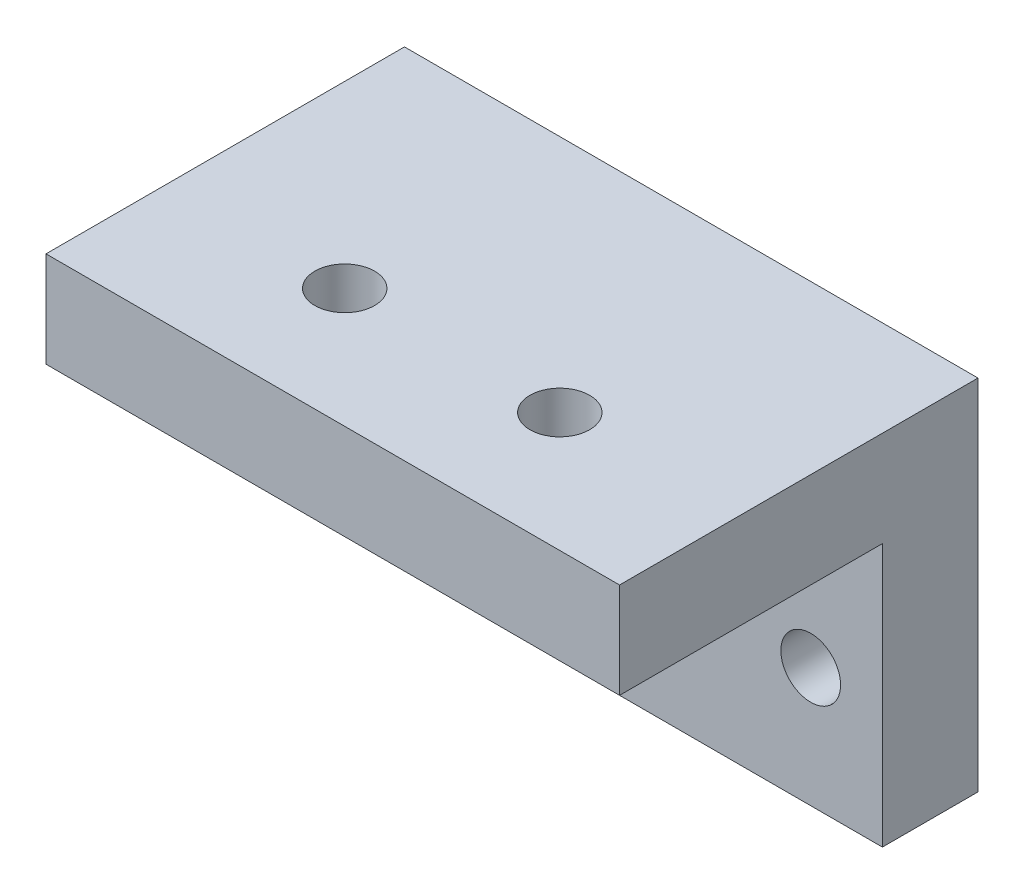
ISO-10303-21;
HEADER;
FILE_DESCRIPTION(('STEP AP214'),'2;1');
FILE_NAME('part.step','',(''),(''),'','','');
FILE_SCHEMA(('AUTOMOTIVE_DESIGN { 1 0 10303 214 1 1 1 1 }'));
ENDSEC;
DATA;
#1=APPLICATION_CONTEXT('core data for automotive mechanical design processes');
#2=APPLICATION_PROTOCOL_DEFINITION('international standard','automotive_design',2000,#1);
#3=PRODUCT_CONTEXT('',#1,'mechanical');
#4=PRODUCT('Part','Part','',(#3));
#5=PRODUCT_RELATED_PRODUCT_CATEGORY('part','',(#4));
#6=PRODUCT_DEFINITION_FORMATION('','',#4);
#7=PRODUCT_DEFINITION_CONTEXT('part definition',#1,'design');
#8=PRODUCT_DEFINITION('design','',#6,#7);
#9=PRODUCT_DEFINITION_SHAPE('','',#8);
#10=(LENGTH_UNIT() NAMED_UNIT(*) SI_UNIT(.MILLI.,.METRE.));
#11=(NAMED_UNIT(*) PLANE_ANGLE_UNIT() SI_UNIT($,.RADIAN.));
#12=(NAMED_UNIT(*) SI_UNIT($,.STERADIAN.) SOLID_ANGLE_UNIT());
#13=UNCERTAINTY_MEASURE_WITH_UNIT(LENGTH_MEASURE(1.E-05),#10,'distance_accuracy_value','');
#14=(GEOMETRIC_REPRESENTATION_CONTEXT(3) GLOBAL_UNCERTAINTY_ASSIGNED_CONTEXT((#13)) GLOBAL_UNIT_ASSIGNED_CONTEXT((#10,
#11,#12)) REPRESENTATION_CONTEXT('',''));
#15=CARTESIAN_POINT('',(0.,0.,0.));
#16=DIRECTION('',(0.,0.,1.));
#17=DIRECTION('',(1.,0.,0.));
#18=AXIS2_PLACEMENT_3D('',#15,#16,#17);
#19=CARTESIAN_POINT('',(12.,7.5,4.));
#20=DIRECTION('',(-1.,0.,0.));
#21=DIRECTION('',(0.,-1.,0.));
#22=AXIS2_PLACEMENT_3D('',#19,#20,#21);
#23=PLANE('',#22);
#24=DIRECTION('',(0.,1.,0.));
#25=VECTOR('',#24,1.);
#26=CARTESIAN_POINT('',(12.,7.5,0.));
#27=LINE('',#26,#25);
#28=CARTESIAN_POINT('',(12.,-7.5,0.));
#29=VERTEX_POINT('',#28);
#30=CARTESIAN_POINT('',(12.,7.5,0.));
#31=VERTEX_POINT('',#30);
#32=EDGE_CURVE('E105',#29,#31,#27,.T.);
#33=ORIENTED_EDGE('',*,*,#32,.T.);
#34=DIRECTION('',(0.,0.,-1.));
#35=VECTOR('',#34,1.);
#36=CARTESIAN_POINT('',(12.,7.5,4.));
#37=LINE('',#36,#35);
#38=CARTESIAN_POINT('',(12.,7.5,15.));
#39=VERTEX_POINT('',#38);
#40=EDGE_CURVE('E11',#39,#31,#37,.T.);
#41=ORIENTED_EDGE('',*,*,#40,.F.);
#42=DIRECTION('',(0.,1.,0.));
#43=VECTOR('',#42,1.);
#44=CARTESIAN_POINT('',(12.,7.5,15.));
#45=LINE('',#44,#43);
#46=CARTESIAN_POINT('',(12.,3.5,15.));
#47=VERTEX_POINT('',#46);
#48=EDGE_CURVE('E143',#47,#39,#45,.T.);
#49=ORIENTED_EDGE('',*,*,#48,.F.);
#50=DIRECTION('',(0.,0.,-1.));
#51=VECTOR('',#50,1.);
#52=CARTESIAN_POINT('',(12.,3.5,15.));
#53=LINE('',#52,#51);
#54=CARTESIAN_POINT('',(12.,3.5,4.));
#55=VERTEX_POINT('',#54);
#56=EDGE_CURVE('E114',#47,#55,#53,.T.);
#57=ORIENTED_EDGE('',*,*,#56,.T.);
#58=DIRECTION('',(0.,1.,0.));
#59=VECTOR('',#58,1.);
#60=CARTESIAN_POINT('',(12.,7.5,4.));
#61=LINE('',#60,#59);
#62=CARTESIAN_POINT('',(12.,-7.5,4.));
#63=VERTEX_POINT('',#62);
#64=EDGE_CURVE('E98',#63,#55,#61,.T.);
#65=ORIENTED_EDGE('',*,*,#64,.F.);
#66=DIRECTION('',(0.,0.,-1.));
#67=VECTOR('',#66,1.);
#68=CARTESIAN_POINT('',(12.,-7.5,4.));
#69=LINE('',#68,#67);
#70=EDGE_CURVE('E88',#63,#29,#69,.T.);
#71=ORIENTED_EDGE('',*,*,#70,.T.);
#72=EDGE_LOOP('',(#33,#41,#49,#57,#65,#71));
#73=FACE_BOUND('',#72,.T.);
#74=ADVANCED_FACE('F44',(#73),#23,.F.);
#75=CARTESIAN_POINT('',(-12.,7.5,4.));
#76=DIRECTION('',(0.,-1.,0.));
#77=DIRECTION('',(0.,0.,-1.));
#78=AXIS2_PLACEMENT_3D('',#75,#76,#77);
#79=PLANE('',#78);
#80=CARTESIAN_POINT('',(-4.5,7.5,10.));
#81=DIRECTION('',(0.,-1.,0.));
#82=DIRECTION('',(0.,0.,-1.));
#83=AXIS2_PLACEMENT_3D('',#80,#81,#82);
#84=CIRCLE('',#83,1.25);
#85=CARTESIAN_POINT('',(-4.5,7.5,8.75));
#86=VERTEX_POINT('',#85);
#87=EDGE_CURVE('E177',#86,#86,#84,.T.);
#88=ORIENTED_EDGE('',*,*,#87,.T.);
#89=EDGE_LOOP('',(#88));
#90=FACE_BOUND('',#89,.T.);
#91=CARTESIAN_POINT('',(4.50000000000001,7.5,10.));
#92=DIRECTION('',(0.,-1.,0.));
#93=DIRECTION('',(0.,0.,-1.));
#94=AXIS2_PLACEMENT_3D('',#91,#92,#93);
#95=CIRCLE('',#94,1.25);
#96=CARTESIAN_POINT('',(4.50000000000001,7.5,8.75));
#97=VERTEX_POINT('',#96);
#98=EDGE_CURVE('E191',#97,#97,#95,.T.);
#99=ORIENTED_EDGE('',*,*,#98,.T.);
#100=EDGE_LOOP('',(#99));
#101=FACE_BOUND('',#100,.T.);
#102=DIRECTION('',(-1.,0.,0.));
#103=VECTOR('',#102,1.);
#104=CARTESIAN_POINT('',(-12.,7.5,0.));
#105=LINE('',#104,#103);
#106=CARTESIAN_POINT('',(-12.,7.5,0.));
#107=VERTEX_POINT('',#106);
#108=EDGE_CURVE('E110',#31,#107,#105,.T.);
#109=ORIENTED_EDGE('',*,*,#108,.T.);
#110=DIRECTION('',(0.,0.,-1.));
#111=VECTOR('',#110,1.);
#112=CARTESIAN_POINT('',(-12.,7.5,4.));
#113=LINE('',#112,#111);
#114=CARTESIAN_POINT('',(-12.,7.5,15.));
#115=VERTEX_POINT('',#114);
#116=EDGE_CURVE('E52',#115,#107,#113,.T.);
#117=ORIENTED_EDGE('',*,*,#116,.F.);
#118=DIRECTION('',(-1.,0.,0.));
#119=VECTOR('',#118,1.);
#120=CARTESIAN_POINT('',(-12.,7.5,15.));
#121=LINE('',#120,#119);
#122=EDGE_CURVE('E139',#39,#115,#121,.T.);
#123=ORIENTED_EDGE('',*,*,#122,.F.);
#124=ORIENTED_EDGE('',*,*,#40,.T.);
#125=EDGE_LOOP('',(#109,#117,#123,#124));
#126=FACE_BOUND('',#125,.T.);
#127=ADVANCED_FACE('F134',(#90,#101,#126),#79,.F.);
#128=CARTESIAN_POINT('',(-12.,7.5,4.));
#129=DIRECTION('',(1.,0.,0.));
#130=DIRECTION('',(0.,1.,0.));
#131=AXIS2_PLACEMENT_3D('',#128,#129,#130);
#132=PLANE('',#131);
#133=DIRECTION('',(0.,-1.,0.));
#134=VECTOR('',#133,1.);
#135=CARTESIAN_POINT('',(-12.,7.5,0.));
#136=LINE('',#135,#134);
#137=CARTESIAN_POINT('',(-12.,-7.5,0.));
#138=VERTEX_POINT('',#137);
#139=EDGE_CURVE('E97',#107,#138,#136,.T.);
#140=ORIENTED_EDGE('',*,*,#139,.T.);
#141=DIRECTION('',(0.,0.,-1.));
#142=VECTOR('',#141,1.);
#143=CARTESIAN_POINT('',(-12.,-7.5,4.));
#144=LINE('',#143,#142);
#145=CARTESIAN_POINT('',(-12.,-7.5,4.));
#146=VERTEX_POINT('',#145);
#147=EDGE_CURVE('E93',#146,#138,#144,.T.);
#148=ORIENTED_EDGE('',*,*,#147,.F.);
#149=DIRECTION('',(0.,-1.,0.));
#150=VECTOR('',#149,1.);
#151=CARTESIAN_POINT('',(-12.,7.5,4.));
#152=LINE('',#151,#150);
#153=CARTESIAN_POINT('',(-12.,3.5,4.));
#154=VERTEX_POINT('',#153);
#155=EDGE_CURVE('E160',#154,#146,#152,.T.);
#156=ORIENTED_EDGE('',*,*,#155,.F.);
#157=DIRECTION('',(0.,0.,-1.));
#158=VECTOR('',#157,1.);
#159=CARTESIAN_POINT('',(-12.,3.5,15.));
#160=LINE('',#159,#158);
#161=CARTESIAN_POINT('',(-12.,3.5,15.));
#162=VERTEX_POINT('',#161);
#163=EDGE_CURVE('E107',#162,#154,#160,.T.);
#164=ORIENTED_EDGE('',*,*,#163,.F.);
#165=DIRECTION('',(0.,-1.,0.));
#166=VECTOR('',#165,1.);
#167=CARTESIAN_POINT('',(-12.,7.5,15.));
#168=LINE('',#167,#166);
#169=EDGE_CURVE('E131',#115,#162,#168,.T.);
#170=ORIENTED_EDGE('',*,*,#169,.F.);
#171=ORIENTED_EDGE('',*,*,#116,.T.);
#172=EDGE_LOOP('',(#140,#148,#156,#164,#170,#171));
#173=FACE_BOUND('',#172,.T.);
#174=ADVANCED_FACE('F129',(#173),#132,.F.);
#175=CARTESIAN_POINT('',(-12.,-7.5,4.));
#176=DIRECTION('',(0.,1.,0.));
#177=DIRECTION('',(0.,0.,1.));
#178=AXIS2_PLACEMENT_3D('',#175,#176,#177);
#179=PLANE('',#178);
#180=DIRECTION('',(1.,0.,0.));
#181=VECTOR('',#180,1.);
#182=CARTESIAN_POINT('',(-12.,-7.5,0.));
#183=LINE('',#182,#181);
#184=EDGE_CURVE('E83',#138,#29,#183,.T.);
#185=ORIENTED_EDGE('',*,*,#184,.T.);
#186=ORIENTED_EDGE('',*,*,#70,.F.);
#187=DIRECTION('',(1.,0.,0.));
#188=VECTOR('',#187,1.);
#189=CARTESIAN_POINT('',(-12.,-7.5,4.));
#190=LINE('',#189,#188);
#191=EDGE_CURVE('E66',#146,#63,#190,.T.);
#192=ORIENTED_EDGE('',*,*,#191,.F.);
#193=ORIENTED_EDGE('',*,*,#147,.T.);
#194=EDGE_LOOP('',(#185,#186,#192,#193));
#195=FACE_BOUND('',#194,.T.);
#196=ADVANCED_FACE('F90',(#195),#179,.F.);
#197=CARTESIAN_POINT('',(0.,0.,4.));
#198=DIRECTION('',(0.,0.,1.));
#199=DIRECTION('',(1.,0.,0.));
#200=AXIS2_PLACEMENT_3D('',#197,#198,#199);
#201=PLANE('',#200);
#202=CARTESIAN_POINT('',(-9.,-2.5,4.));
#203=DIRECTION('',(0.,0.,1.));
#204=DIRECTION('',(1.,0.,0.));
#205=AXIS2_PLACEMENT_3D('',#202,#203,#204);
#206=CIRCLE('',#205,1.25);
#207=CARTESIAN_POINT('',(-7.75,-2.5,4.));
#208=VERTEX_POINT('',#207);
#209=EDGE_CURVE('E182',#208,#208,#206,.T.);
#210=ORIENTED_EDGE('',*,*,#209,.F.);
#211=EDGE_LOOP('',(#210));
#212=FACE_BOUND('',#211,.T.);
#213=CARTESIAN_POINT('',(9.,-2.5,4.));
#214=DIRECTION('',(0.,0.,1.));
#215=DIRECTION('',(1.,0.,0.));
#216=AXIS2_PLACEMENT_3D('',#213,#214,#215);
#217=CIRCLE('',#216,1.25);
#218=CARTESIAN_POINT('',(10.25,-2.5,4.));
#219=VERTEX_POINT('',#218);
#220=EDGE_CURVE('E172',#219,#219,#217,.T.);
#221=ORIENTED_EDGE('',*,*,#220,.F.);
#222=EDGE_LOOP('',(#221));
#223=FACE_BOUND('',#222,.T.);
#224=DIRECTION('',(1.,0.,0.));
#225=VECTOR('',#224,1.);
#226=CARTESIAN_POINT('',(-12.,3.5,4.));
#227=LINE('',#226,#225);
#228=EDGE_CURVE('E58',#154,#55,#227,.T.);
#229=ORIENTED_EDGE('',*,*,#228,.F.);
#230=ORIENTED_EDGE('',*,*,#155,.T.);
#231=ORIENTED_EDGE('',*,*,#191,.T.);
#232=ORIENTED_EDGE('',*,*,#64,.T.);
#233=EDGE_LOOP('',(#229,#230,#231,#232));
#234=FACE_BOUND('',#233,.T.);
#235=ADVANCED_FACE('F162',(#212,#223,#234),#201,.T.);
#236=CARTESIAN_POINT('',(0.,0.,0.));
#237=DIRECTION('',(0.,0.,1.));
#238=DIRECTION('',(1.,0.,0.));
#239=AXIS2_PLACEMENT_3D('',#236,#237,#238);
#240=PLANE('',#239);
#241=CARTESIAN_POINT('',(-9.,-2.5,0.));
#242=DIRECTION('',(0.,0.,1.));
#243=DIRECTION('',(1.,0.,0.));
#244=AXIS2_PLACEMENT_3D('',#241,#242,#243);
#245=CIRCLE('',#244,1.25);
#246=CARTESIAN_POINT('',(-7.75,-2.5,0.));
#247=VERTEX_POINT('',#246);
#248=EDGE_CURVE('E158',#247,#247,#245,.T.);
#249=ORIENTED_EDGE('',*,*,#248,.T.);
#250=EDGE_LOOP('',(#249));
#251=FACE_BOUND('',#250,.T.);
#252=CARTESIAN_POINT('',(9.,-2.5,0.));
#253=DIRECTION('',(0.,0.,1.));
#254=DIRECTION('',(1.,0.,0.));
#255=AXIS2_PLACEMENT_3D('',#252,#253,#254);
#256=CIRCLE('',#255,1.25);
#257=CARTESIAN_POINT('',(10.25,-2.5,0.));
#258=VERTEX_POINT('',#257);
#259=EDGE_CURVE('E178',#258,#258,#256,.T.);
#260=ORIENTED_EDGE('',*,*,#259,.T.);
#261=EDGE_LOOP('',(#260));
#262=FACE_BOUND('',#261,.T.);
#263=ORIENTED_EDGE('',*,*,#32,.F.);
#264=ORIENTED_EDGE('',*,*,#184,.F.);
#265=ORIENTED_EDGE('',*,*,#139,.F.);
#266=ORIENTED_EDGE('',*,*,#108,.F.);
#267=EDGE_LOOP('',(#263,#264,#265,#266));
#268=FACE_BOUND('',#267,.T.);
#269=ADVANCED_FACE('F106',(#251,#262,#268),#240,.F.);
#270=CARTESIAN_POINT('',(-12.,3.5,15.));
#271=DIRECTION('',(0.,1.,0.));
#272=DIRECTION('',(0.,0.,1.));
#273=AXIS2_PLACEMENT_3D('',#270,#271,#272);
#274=PLANE('',#273);
#275=CARTESIAN_POINT('',(-4.5,3.5,10.));
#276=DIRECTION('',(0.,-1.,0.));
#277=DIRECTION('',(0.,0.,-1.));
#278=AXIS2_PLACEMENT_3D('',#275,#276,#277);
#279=CIRCLE('',#278,1.25);
#280=CARTESIAN_POINT('',(-4.5,3.5,8.75));
#281=VERTEX_POINT('',#280);
#282=EDGE_CURVE('E198',#281,#281,#279,.T.);
#283=ORIENTED_EDGE('',*,*,#282,.F.);
#284=EDGE_LOOP('',(#283));
#285=FACE_BOUND('',#284,.T.);
#286=CARTESIAN_POINT('',(4.50000000000001,3.5,10.));
#287=DIRECTION('',(0.,-1.,0.));
#288=DIRECTION('',(0.,0.,-1.));
#289=AXIS2_PLACEMENT_3D('',#286,#287,#288);
#290=CIRCLE('',#289,1.25);
#291=CARTESIAN_POINT('',(4.50000000000001,3.5,8.75));
#292=VERTEX_POINT('',#291);
#293=EDGE_CURVE('E188',#292,#292,#290,.T.);
#294=ORIENTED_EDGE('',*,*,#293,.F.);
#295=EDGE_LOOP('',(#294));
#296=FACE_BOUND('',#295,.T.);
#297=ORIENTED_EDGE('',*,*,#228,.T.);
#298=ORIENTED_EDGE('',*,*,#56,.F.);
#299=DIRECTION('',(1.,0.,0.));
#300=VECTOR('',#299,1.);
#301=CARTESIAN_POINT('',(-12.,3.5,15.));
#302=LINE('',#301,#300);
#303=EDGE_CURVE('E151',#162,#47,#302,.T.);
#304=ORIENTED_EDGE('',*,*,#303,.F.);
#305=ORIENTED_EDGE('',*,*,#163,.T.);
#306=EDGE_LOOP('',(#297,#298,#304,#305));
#307=FACE_BOUND('',#306,.T.);
#308=ADVANCED_FACE('F164',(#285,#296,#307),#274,.F.);
#309=CARTESIAN_POINT('',(0.,0.,15.));
#310=DIRECTION('',(0.,0.,1.));
#311=DIRECTION('',(1.,0.,0.));
#312=AXIS2_PLACEMENT_3D('',#309,#310,#311);
#313=PLANE('',#312);
#314=ORIENTED_EDGE('',*,*,#169,.T.);
#315=ORIENTED_EDGE('',*,*,#303,.T.);
#316=ORIENTED_EDGE('',*,*,#48,.T.);
#317=ORIENTED_EDGE('',*,*,#122,.T.);
#318=EDGE_LOOP('',(#314,#315,#316,#317));
#319=FACE_BOUND('',#318,.T.);
#320=ADVANCED_FACE('F142',(#319),#313,.T.);
#321=CARTESIAN_POINT('',(9.,-2.5,0.));
#322=DIRECTION('',(0.,0.,1.));
#323=DIRECTION('',(1.,0.,0.));
#324=AXIS2_PLACEMENT_3D('',#321,#322,#323);
#325=CYLINDRICAL_SURFACE('',#324,1.25);
#326=ORIENTED_EDGE('',*,*,#259,.F.);
#327=EDGE_LOOP('',(#326));
#328=FACE_BOUND('',#327,.T.);
#329=ORIENTED_EDGE('',*,*,#220,.T.);
#330=EDGE_LOOP('',(#329));
#331=FACE_BOUND('',#330,.T.);
#332=ADVANCED_FACE('F227',(#328,#331),#325,.F.);
#333=CARTESIAN_POINT('',(-9.,-2.5,0.));
#334=DIRECTION('',(0.,0.,1.));
#335=DIRECTION('',(1.,0.,0.));
#336=AXIS2_PLACEMENT_3D('',#333,#334,#335);
#337=CYLINDRICAL_SURFACE('',#336,1.25);
#338=ORIENTED_EDGE('',*,*,#248,.F.);
#339=EDGE_LOOP('',(#338));
#340=FACE_BOUND('',#339,.T.);
#341=ORIENTED_EDGE('',*,*,#209,.T.);
#342=EDGE_LOOP('',(#341));
#343=FACE_BOUND('',#342,.T.);
#344=ADVANCED_FACE('F223',(#340,#343),#337,.F.);
#345=CARTESIAN_POINT('',(4.50000000000001,7.5,10.));
#346=DIRECTION('',(0.,-1.,0.));
#347=DIRECTION('',(0.,0.,-1.));
#348=AXIS2_PLACEMENT_3D('',#345,#346,#347);
#349=CYLINDRICAL_SURFACE('',#348,1.25);
#350=ORIENTED_EDGE('',*,*,#98,.F.);
#351=EDGE_LOOP('',(#350));
#352=FACE_BOUND('',#351,.T.);
#353=ORIENTED_EDGE('',*,*,#293,.T.);
#354=EDGE_LOOP('',(#353));
#355=FACE_BOUND('',#354,.T.);
#356=ADVANCED_FACE('F212',(#352,#355),#349,.F.);
#357=CARTESIAN_POINT('',(-4.5,7.5,10.));
#358=DIRECTION('',(0.,-1.,0.));
#359=DIRECTION('',(0.,0.,-1.));
#360=AXIS2_PLACEMENT_3D('',#357,#358,#359);
#361=CYLINDRICAL_SURFACE('',#360,1.25);
#362=ORIENTED_EDGE('',*,*,#87,.F.);
#363=EDGE_LOOP('',(#362));
#364=FACE_BOUND('',#363,.T.);
#365=ORIENTED_EDGE('',*,*,#282,.T.);
#366=EDGE_LOOP('',(#365));
#367=FACE_BOUND('',#366,.T.);
#368=ADVANCED_FACE('F206',(#364,#367),#361,.F.);
#369=CLOSED_SHELL('',(#74,#127,#174,#196,#235,#269,#308,#320,#332,#344,#356,#368));
#370=MANIFOLD_SOLID_BREP('B2',#369);
#371=ADVANCED_BREP_SHAPE_REPRESENTATION('',(#18,#370),#14);
#372=SHAPE_DEFINITION_REPRESENTATION(#9,#371);
ENDSEC;
END-ISO-10303-21;
